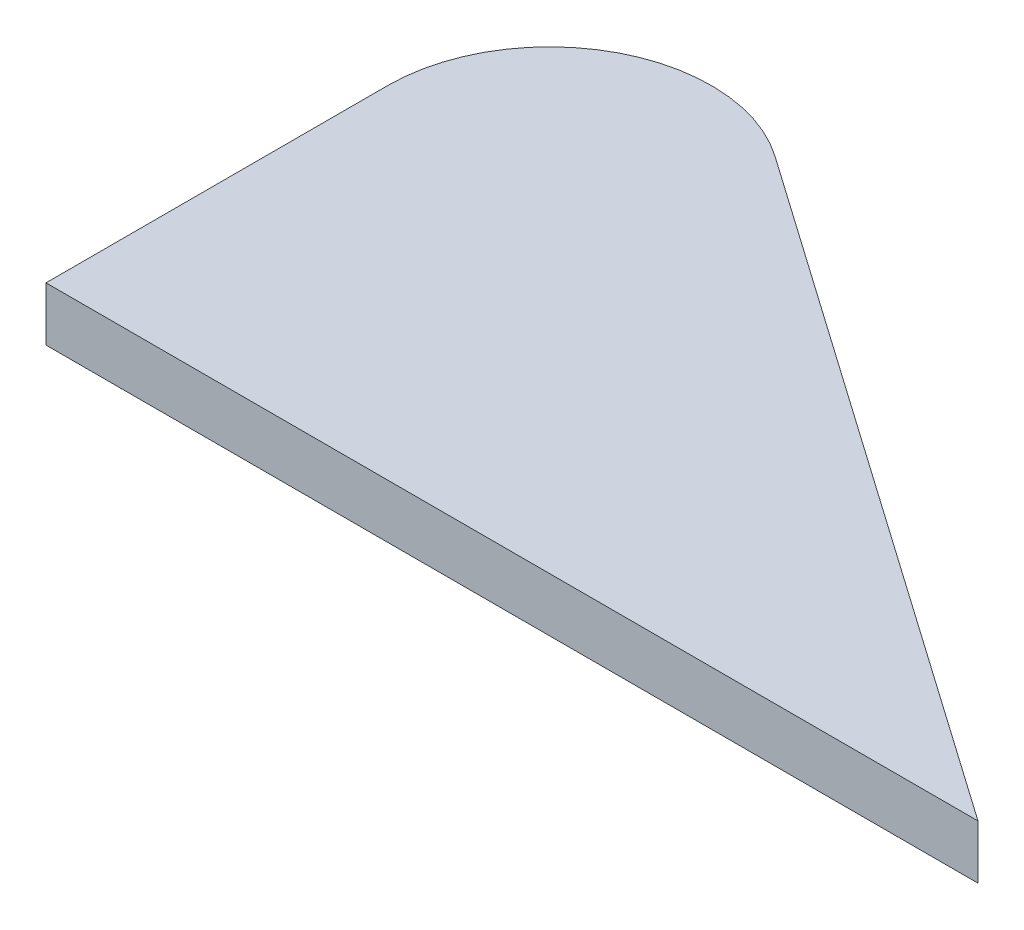
ISO-10303-21;
HEADER;
FILE_DESCRIPTION(('STEP AP214'),'2;1');
FILE_NAME('part.step','',(''),(''),'','','');
FILE_SCHEMA(('AUTOMOTIVE_DESIGN { 1 0 10303 214 1 1 1 1 }'));
ENDSEC;
DATA;
#1=APPLICATION_CONTEXT('core data for automotive mechanical design processes');
#2=APPLICATION_PROTOCOL_DEFINITION('international standard','automotive_design',2000,#1);
#3=PRODUCT_CONTEXT('',#1,'mechanical');
#4=PRODUCT('Part','Part','',(#3));
#5=PRODUCT_RELATED_PRODUCT_CATEGORY('part','',(#4));
#6=PRODUCT_DEFINITION_FORMATION('','',#4);
#7=PRODUCT_DEFINITION_CONTEXT('part definition',#1,'design');
#8=PRODUCT_DEFINITION('design','',#6,#7);
#9=PRODUCT_DEFINITION_SHAPE('','',#8);
#10=(LENGTH_UNIT() NAMED_UNIT(*) SI_UNIT(.MILLI.,.METRE.));
#11=(NAMED_UNIT(*) PLANE_ANGLE_UNIT() SI_UNIT($,.RADIAN.));
#12=(NAMED_UNIT(*) SI_UNIT($,.STERADIAN.) SOLID_ANGLE_UNIT());
#13=UNCERTAINTY_MEASURE_WITH_UNIT(LENGTH_MEASURE(1.E-05),#10,'distance_accuracy_value','');
#14=(GEOMETRIC_REPRESENTATION_CONTEXT(3) GLOBAL_UNCERTAINTY_ASSIGNED_CONTEXT((#13)) GLOBAL_UNIT_ASSIGNED_CONTEXT((#10,
#11,#12)) REPRESENTATION_CONTEXT('',''));
#15=CARTESIAN_POINT('',(0.,0.,0.));
#16=DIRECTION('',(0.,0.,1.));
#17=DIRECTION('',(1.,0.,0.));
#18=AXIS2_PLACEMENT_3D('',#15,#16,#17);
#19=CARTESIAN_POINT('',(19.05,6.35,-40.2442440840944));
#20=DIRECTION('',(0.,-1.,0.));
#21=DIRECTION('',(0.,0.,-1.));
#22=AXIS2_PLACEMENT_3D('',#19,#20,#21);
#23=CYLINDRICAL_SURFACE('',#22,19.05);
#24=CARTESIAN_POINT('',(19.05,0.,-40.2442440840944));
#25=DIRECTION('',(0.,1.,0.));
#26=DIRECTION('',(0.,0.,1.));
#27=AXIS2_PLACEMENT_3D('',#24,#25,#26);
#28=CIRCLE('',#27,19.05);
#29=CARTESIAN_POINT('',(29.9766311124874,0.,-55.8490905277997));
#30=VERTEX_POINT('',#29);
#31=CARTESIAN_POINT('',(0.,0.,-40.2442440840944));
#32=VERTEX_POINT('',#31);
#33=EDGE_CURVE('E108',#30,#32,#28,.T.);
#34=ORIENTED_EDGE('',*,*,#33,.T.);
#35=DIRECTION('',(0.,-1.,0.));
#36=VECTOR('',#35,1.);
#37=CARTESIAN_POINT('',(0.,6.35,-40.2442440840944));
#38=LINE('',#37,#36);
#39=CARTESIAN_POINT('',(0.,6.35,-40.2442440840944));
#40=VERTEX_POINT('',#39);
#41=EDGE_CURVE('E11',#40,#32,#38,.T.);
#42=ORIENTED_EDGE('',*,*,#41,.F.);
#43=CARTESIAN_POINT('',(19.05,6.35,-40.2442440840944));
#44=DIRECTION('',(0.,1.,0.));
#45=DIRECTION('',(0.,0.,1.));
#46=AXIS2_PLACEMENT_3D('',#43,#44,#45);
#47=CIRCLE('',#46,19.05);
#48=CARTESIAN_POINT('',(29.9766311124874,6.35,-55.8490905277997));
#49=VERTEX_POINT('',#48);
#50=EDGE_CURVE('E82',#49,#40,#47,.T.);
#51=ORIENTED_EDGE('',*,*,#50,.F.);
#52=DIRECTION('',(0.,-1.,0.));
#53=VECTOR('',#52,1.);
#54=CARTESIAN_POINT('',(29.9766311124874,6.35,-55.8490905277997));
#55=LINE('',#54,#53);
#56=EDGE_CURVE('E107',#49,#30,#55,.T.);
#57=ORIENTED_EDGE('',*,*,#56,.T.);
#58=EDGE_LOOP('',(#34,#42,#51,#57));
#59=FACE_BOUND('',#58,.T.);
#60=ADVANCED_FACE('F39',(#59),#23,.T.);
#61=CARTESIAN_POINT('',(0.,6.35,0.));
#62=DIRECTION('',(-1.,0.,0.));
#63=DIRECTION('',(0.,0.,1.));
#64=AXIS2_PLACEMENT_3D('',#61,#62,#63);
#65=PLANE('',#64);
#66=DIRECTION('',(0.,0.,-1.));
#67=VECTOR('',#66,1.);
#68=CARTESIAN_POINT('',(0.,0.,0.));
#69=LINE('',#68,#67);
#70=CARTESIAN_POINT('',(0.,0.,0.));
#71=VERTEX_POINT('',#70);
#72=EDGE_CURVE('E92',#71,#32,#69,.T.);
#73=ORIENTED_EDGE('',*,*,#72,.F.);
#74=DIRECTION('',(0.,-1.,0.));
#75=VECTOR('',#74,1.);
#76=CARTESIAN_POINT('',(0.,6.35,0.));
#77=LINE('',#76,#75);
#78=CARTESIAN_POINT('',(0.,6.35,0.));
#79=VERTEX_POINT('',#78);
#80=EDGE_CURVE('E48',#79,#71,#77,.T.);
#81=ORIENTED_EDGE('',*,*,#80,.F.);
#82=DIRECTION('',(0.,0.,-1.));
#83=VECTOR('',#82,1.);
#84=CARTESIAN_POINT('',(0.,6.35,0.));
#85=LINE('',#84,#83);
#86=EDGE_CURVE('E90',#79,#40,#85,.T.);
#87=ORIENTED_EDGE('',*,*,#86,.T.);
#88=ORIENTED_EDGE('',*,*,#41,.T.);
#89=EDGE_LOOP('',(#73,#81,#87,#88));
#90=FACE_BOUND('',#89,.T.);
#91=ADVANCED_FACE('F89',(#90),#65,.T.);
#92=CARTESIAN_POINT('',(19.05,6.35,0.));
#93=DIRECTION('',(0.,0.,-1.));
#94=DIRECTION('',(-1.,0.,0.));
#95=AXIS2_PLACEMENT_3D('',#92,#93,#94);
#96=PLANE('',#95);
#97=DIRECTION('',(1.,0.,0.));
#98=VECTOR('',#97,1.);
#99=CARTESIAN_POINT('',(19.05,0.,0.));
#100=LINE('',#99,#98);
#101=CARTESIAN_POINT('',(109.737398428125,0.,0.));
#102=VERTEX_POINT('',#101);
#103=EDGE_CURVE('E71',#71,#102,#100,.T.);
#104=ORIENTED_EDGE('',*,*,#103,.T.);
#105=DIRECTION('',(0.,-1.,0.));
#106=VECTOR('',#105,1.);
#107=CARTESIAN_POINT('',(109.737398428125,6.35,0.));
#108=LINE('',#107,#106);
#109=CARTESIAN_POINT('',(109.737398428125,6.35,0.));
#110=VERTEX_POINT('',#109);
#111=EDGE_CURVE('E94',#110,#102,#108,.T.);
#112=ORIENTED_EDGE('',*,*,#111,.F.);
#113=DIRECTION('',(1.,0.,0.));
#114=VECTOR('',#113,1.);
#115=CARTESIAN_POINT('',(0.,6.35,0.));
#116=LINE('',#115,#114);
#117=EDGE_CURVE('E95',#79,#110,#116,.T.);
#118=ORIENTED_EDGE('',*,*,#117,.F.);
#119=ORIENTED_EDGE('',*,*,#80,.T.);
#120=EDGE_LOOP('',(#104,#112,#118,#119));
#121=FACE_BOUND('',#120,.T.);
#122=ADVANCED_FACE('F96',(#121),#96,.F.);
#123=CARTESIAN_POINT('',(109.737398428125,6.35,0.));
#124=DIRECTION('',(-0.573576436351041,0.,0.819152044288995));
#125=DIRECTION('',(0.819152044288995,0.,0.573576436351041));
#126=AXIS2_PLACEMENT_3D('',#123,#124,#125);
#127=PLANE('',#126);
#128=DIRECTION('',(-0.819152044288995,0.,-0.573576436351041));
#129=VECTOR('',#128,1.);
#130=CARTESIAN_POINT('',(109.737398428125,0.,0.));
#131=LINE('',#130,#129);
#132=EDGE_CURVE('E77',#102,#30,#131,.T.);
#133=ORIENTED_EDGE('',*,*,#132,.T.);
#134=ORIENTED_EDGE('',*,*,#56,.F.);
#135=DIRECTION('',(-0.819152044288995,0.,-0.573576436351041));
#136=VECTOR('',#135,1.);
#137=CARTESIAN_POINT('',(109.737398428125,6.35,0.));
#138=LINE('',#137,#136);
#139=EDGE_CURVE('E56',#110,#49,#138,.T.);
#140=ORIENTED_EDGE('',*,*,#139,.F.);
#141=ORIENTED_EDGE('',*,*,#111,.T.);
#142=EDGE_LOOP('',(#133,#134,#140,#141));
#143=FACE_BOUND('',#142,.T.);
#144=ADVANCED_FACE('F121',(#143),#127,.F.);
#145=CARTESIAN_POINT('',(19.05,6.35,-40.2442440840944));
#146=DIRECTION('',(0.,1.,0.));
#147=DIRECTION('',(0.,0.,1.));
#148=AXIS2_PLACEMENT_3D('',#145,#146,#147);
#149=PLANE('',#148);
#150=ORIENTED_EDGE('',*,*,#50,.T.);
#151=ORIENTED_EDGE('',*,*,#86,.F.);
#152=ORIENTED_EDGE('',*,*,#117,.T.);
#153=ORIENTED_EDGE('',*,*,#139,.T.);
#154=EDGE_LOOP('',(#150,#151,#152,#153));
#155=FACE_BOUND('',#154,.T.);
#156=ADVANCED_FACE('F99',(#155),#149,.T.);
#157=CARTESIAN_POINT('',(19.05,0.,-40.2442440840944));
#158=DIRECTION('',(0.,1.,0.));
#159=DIRECTION('',(0.,0.,1.));
#160=AXIS2_PLACEMENT_3D('',#157,#158,#159);
#161=PLANE('',#160);
#162=ORIENTED_EDGE('',*,*,#33,.F.);
#163=ORIENTED_EDGE('',*,*,#132,.F.);
#164=ORIENTED_EDGE('',*,*,#103,.F.);
#165=ORIENTED_EDGE('',*,*,#72,.T.);
#166=EDGE_LOOP('',(#162,#163,#164,#165));
#167=FACE_BOUND('',#166,.T.);
#168=ADVANCED_FACE('F124',(#167),#161,.F.);
#169=CLOSED_SHELL('',(#60,#91,#122,#144,#156,#168));
#170=MANIFOLD_SOLID_BREP('B2',#169);
#171=ADVANCED_BREP_SHAPE_REPRESENTATION('',(#18,#170),#14);
#172=SHAPE_DEFINITION_REPRESENTATION(#9,#171);
ENDSEC;
END-ISO-10303-21;
